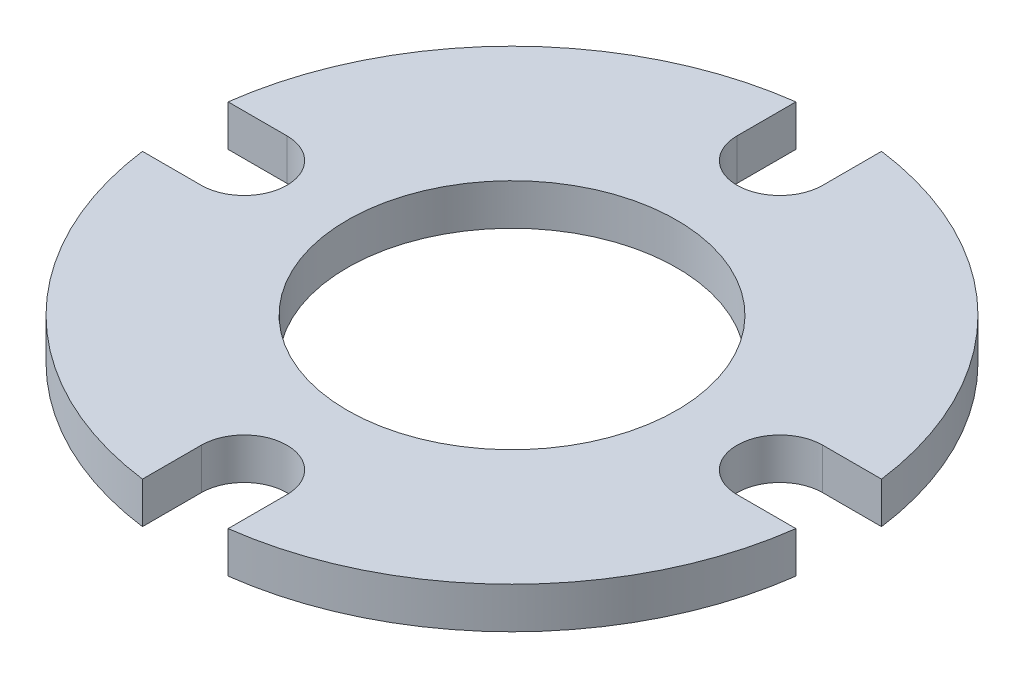
ISO-10303-21;
HEADER;
FILE_DESCRIPTION(('STEP AP214'),'2;1');
FILE_NAME('part.step','',(''),(''),'','','');
FILE_SCHEMA(('AUTOMOTIVE_DESIGN { 1 0 10303 214 1 1 1 1 }'));
ENDSEC;
DATA;
#1=APPLICATION_CONTEXT('core data for automotive mechanical design processes');
#2=APPLICATION_PROTOCOL_DEFINITION('international standard','automotive_design',2000,#1);
#3=PRODUCT_CONTEXT('',#1,'mechanical');
#4=PRODUCT('Part','Part','',(#3));
#5=PRODUCT_RELATED_PRODUCT_CATEGORY('part','',(#4));
#6=PRODUCT_DEFINITION_FORMATION('','',#4);
#7=PRODUCT_DEFINITION_CONTEXT('part definition',#1,'design');
#8=PRODUCT_DEFINITION('design','',#6,#7);
#9=PRODUCT_DEFINITION_SHAPE('','',#8);
#10=(LENGTH_UNIT() NAMED_UNIT(*) SI_UNIT(.MILLI.,.METRE.));
#11=(NAMED_UNIT(*) PLANE_ANGLE_UNIT() SI_UNIT($,.RADIAN.));
#12=(NAMED_UNIT(*) SI_UNIT($,.STERADIAN.) SOLID_ANGLE_UNIT());
#13=UNCERTAINTY_MEASURE_WITH_UNIT(LENGTH_MEASURE(1.E-05),#10,'distance_accuracy_value','');
#14=(GEOMETRIC_REPRESENTATION_CONTEXT(3) GLOBAL_UNCERTAINTY_ASSIGNED_CONTEXT((#13)) GLOBAL_UNIT_ASSIGNED_CONTEXT((#10,
#11,#12)) REPRESENTATION_CONTEXT('',''));
#15=CARTESIAN_POINT('',(0.,0.,0.));
#16=DIRECTION('',(0.,0.,1.));
#17=DIRECTION('',(1.,0.,0.));
#18=AXIS2_PLACEMENT_3D('',#15,#16,#17);
#19=CARTESIAN_POINT('',(0.,0.125,0.));
#20=DIRECTION('',(0.,1.,0.));
#21=DIRECTION('',(0.,0.,1.));
#22=AXIS2_PLACEMENT_3D('',#19,#20,#21);
#23=PLANE('',#22);
#24=CARTESIAN_POINT('',(0.,0.125,0.));
#25=DIRECTION('',(0.,1.,0.));
#26=DIRECTION('',(0.,0.,1.));
#27=AXIS2_PLACEMENT_3D('',#24,#25,#26);
#28=CIRCLE('',#27,0.999999999999999);
#29=CARTESIAN_POINT('',(-0.13,0.125,-0.991513993849809));
#30=VERTEX_POINT('',#29);
#31=CARTESIAN_POINT('',(-0.991513993849809,0.125,-0.13));
#32=VERTEX_POINT('',#31);
#33=EDGE_CURVE('E213',#30,#32,#28,.T.);
#34=ORIENTED_EDGE('',*,*,#33,.T.);
#35=DIRECTION('',(1.,0.,0.));
#36=VECTOR('',#35,1.);
#37=CARTESIAN_POINT('',(-0.991513993849809,0.125,-0.13));
#38=LINE('',#37,#36);
#39=CARTESIAN_POINT('',(-0.813,0.125,-0.13));
#40=VERTEX_POINT('',#39);
#41=EDGE_CURVE('E121',#32,#40,#38,.T.);
#42=ORIENTED_EDGE('',*,*,#41,.T.);
#43=CARTESIAN_POINT('',(-0.813,0.125,0.));
#44=DIRECTION('',(0.,-1.,0.));
#45=DIRECTION('',(0.,0.,1.));
#46=AXIS2_PLACEMENT_3D('',#43,#44,#45);
#47=CIRCLE('',#46,0.13);
#48=CARTESIAN_POINT('',(-0.813,0.125,0.13));
#49=VERTEX_POINT('',#48);
#50=EDGE_CURVE('E252',#40,#49,#47,.T.);
#51=ORIENTED_EDGE('',*,*,#50,.T.);
#52=DIRECTION('',(-1.,0.,0.));
#53=VECTOR('',#52,1.);
#54=CARTESIAN_POINT('',(-0.991513993849809,0.125,0.13));
#55=LINE('',#54,#53);
#56=CARTESIAN_POINT('',(-0.991513993849809,0.125,0.13));
#57=VERTEX_POINT('',#56);
#58=EDGE_CURVE('E271',#49,#57,#55,.T.);
#59=ORIENTED_EDGE('',*,*,#58,.T.);
#60=CARTESIAN_POINT('',(0.,0.125,0.));
#61=DIRECTION('',(0.,1.,0.));
#62=DIRECTION('',(0.,0.,1.));
#63=AXIS2_PLACEMENT_3D('',#60,#61,#62);
#64=CIRCLE('',#63,0.999999999999999);
#65=CARTESIAN_POINT('',(-0.13,0.125,0.991513993849809));
#66=VERTEX_POINT('',#65);
#67=EDGE_CURVE('E268',#57,#66,#64,.T.);
#68=ORIENTED_EDGE('',*,*,#67,.T.);
#69=DIRECTION('',(0.,0.,-1.));
#70=VECTOR('',#69,1.);
#71=CARTESIAN_POINT('',(-0.13,0.125,0.991513993849809));
#72=LINE('',#71,#70);
#73=CARTESIAN_POINT('',(-0.13,0.125,0.813));
#74=VERTEX_POINT('',#73);
#75=EDGE_CURVE('E270',#66,#74,#72,.T.);
#76=ORIENTED_EDGE('',*,*,#75,.T.);
#77=CARTESIAN_POINT('',(0.,0.125,0.813));
#78=DIRECTION('',(0.,-1.,0.));
#79=DIRECTION('',(0.,0.,-1.));
#80=AXIS2_PLACEMENT_3D('',#77,#78,#79);
#81=CIRCLE('',#80,0.13);
#82=CARTESIAN_POINT('',(0.13,0.125,0.813));
#83=VERTEX_POINT('',#82);
#84=EDGE_CURVE('E273',#74,#83,#81,.T.);
#85=ORIENTED_EDGE('',*,*,#84,.T.);
#86=DIRECTION('',(0.,0.,1.));
#87=VECTOR('',#86,1.);
#88=CARTESIAN_POINT('',(0.13,0.125,0.991513993849809));
#89=LINE('',#88,#87);
#90=CARTESIAN_POINT('',(0.13,0.125,0.991513993849809));
#91=VERTEX_POINT('',#90);
#92=EDGE_CURVE('E279',#83,#91,#89,.T.);
#93=ORIENTED_EDGE('',*,*,#92,.T.);
#94=CARTESIAN_POINT('',(0.,0.125,0.));
#95=DIRECTION('',(0.,1.,0.));
#96=DIRECTION('',(0.,0.,1.));
#97=AXIS2_PLACEMENT_3D('',#94,#95,#96);
#98=CIRCLE('',#97,0.999999999999999);
#99=CARTESIAN_POINT('',(0.991513993849809,0.125,0.129999999999999));
#100=VERTEX_POINT('',#99);
#101=EDGE_CURVE('E281',#91,#100,#98,.T.);
#102=ORIENTED_EDGE('',*,*,#101,.T.);
#103=DIRECTION('',(-1.,0.,0.));
#104=VECTOR('',#103,1.);
#105=CARTESIAN_POINT('',(0.991513993849809,0.125,0.129999999999999));
#106=LINE('',#105,#104);
#107=CARTESIAN_POINT('',(0.813,0.125,0.129999999999999));
#108=VERTEX_POINT('',#107);
#109=EDGE_CURVE('E283',#100,#108,#106,.T.);
#110=ORIENTED_EDGE('',*,*,#109,.T.);
#111=CARTESIAN_POINT('',(0.813,0.125,0.));
#112=DIRECTION('',(0.,-1.,0.));
#113=DIRECTION('',(0.,0.,-1.));
#114=AXIS2_PLACEMENT_3D('',#111,#112,#113);
#115=CIRCLE('',#114,0.13);
#116=CARTESIAN_POINT('',(0.813,0.125,-0.130000000000001));
#117=VERTEX_POINT('',#116);
#118=EDGE_CURVE('E285',#108,#117,#115,.T.);
#119=ORIENTED_EDGE('',*,*,#118,.T.);
#120=DIRECTION('',(1.,0.,0.));
#121=VECTOR('',#120,1.);
#122=CARTESIAN_POINT('',(0.991513993849809,0.125,-0.130000000000001));
#123=LINE('',#122,#121);
#124=CARTESIAN_POINT('',(0.991513993849809,0.125,-0.130000000000001));
#125=VERTEX_POINT('',#124);
#126=EDGE_CURVE('E287',#117,#125,#123,.T.);
#127=ORIENTED_EDGE('',*,*,#126,.T.);
#128=CARTESIAN_POINT('',(0.,0.125,0.));
#129=DIRECTION('',(0.,1.,0.));
#130=DIRECTION('',(0.,0.,1.));
#131=AXIS2_PLACEMENT_3D('',#128,#129,#130);
#132=CIRCLE('',#131,1.);
#133=CARTESIAN_POINT('',(0.13,0.125,-0.991513993849809));
#134=VERTEX_POINT('',#133);
#135=EDGE_CURVE('E164',#125,#134,#132,.T.);
#136=ORIENTED_EDGE('',*,*,#135,.T.);
#137=DIRECTION('',(0.,0.,1.));
#138=VECTOR('',#137,1.);
#139=CARTESIAN_POINT('',(0.13,0.125,-0.991513993849809));
#140=LINE('',#139,#138);
#141=CARTESIAN_POINT('',(0.13,0.125,-0.813));
#142=VERTEX_POINT('',#141);
#143=EDGE_CURVE('E158',#134,#142,#140,.T.);
#144=ORIENTED_EDGE('',*,*,#143,.T.);
#145=CARTESIAN_POINT('',(0.,0.125,-0.813));
#146=DIRECTION('',(0.,-1.,0.));
#147=DIRECTION('',(0.,0.,1.));
#148=AXIS2_PLACEMENT_3D('',#145,#146,#147);
#149=CIRCLE('',#148,0.13);
#150=CARTESIAN_POINT('',(-0.13,0.125,-0.813));
#151=VERTEX_POINT('',#150);
#152=EDGE_CURVE('E162',#142,#151,#149,.T.);
#153=ORIENTED_EDGE('',*,*,#152,.T.);
#154=DIRECTION('',(0.,0.,-1.));
#155=VECTOR('',#154,1.);
#156=CARTESIAN_POINT('',(-0.13,0.125,-0.991513993849809));
#157=LINE('',#156,#155);
#158=EDGE_CURVE('E54',#151,#30,#157,.T.);
#159=ORIENTED_EDGE('',*,*,#158,.T.);
#160=EDGE_LOOP('',(#34,#42,#51,#59,#68,#76,#85,#93,#102,#110,#119,#127,#136,#144,#153,#159));
#161=FACE_BOUND('',#160,.T.);
#162=CARTESIAN_POINT('',(0.,0.125,0.));
#163=DIRECTION('',(0.,1.,0.));
#164=DIRECTION('',(0.,0.,1.));
#165=AXIS2_PLACEMENT_3D('',#162,#163,#164);
#166=CIRCLE('',#165,0.5);
#167=CARTESIAN_POINT('',(0.,0.125,0.5));
#168=VERTEX_POINT('',#167);
#169=EDGE_CURVE('E186',#168,#168,#166,.T.);
#170=ORIENTED_EDGE('',*,*,#169,.F.);
#171=EDGE_LOOP('',(#170));
#172=FACE_BOUND('',#171,.T.);
#173=ADVANCED_FACE('F37',(#161,#172),#23,.T.);
#174=CARTESIAN_POINT('',(0.,0.,0.));
#175=DIRECTION('',(0.,1.,0.));
#176=DIRECTION('',(0.,0.,1.));
#177=AXIS2_PLACEMENT_3D('',#174,#175,#176);
#178=PLANE('',#177);
#179=CARTESIAN_POINT('',(0.,0.,0.));
#180=DIRECTION('',(0.,1.,0.));
#181=DIRECTION('',(0.,0.,1.));
#182=AXIS2_PLACEMENT_3D('',#179,#180,#181);
#183=CIRCLE('',#182,0.999999999999999);
#184=CARTESIAN_POINT('',(-0.13,0.,-0.991513993849809));
#185=VERTEX_POINT('',#184);
#186=CARTESIAN_POINT('',(-0.991513993849809,0.,-0.13));
#187=VERTEX_POINT('',#186);
#188=EDGE_CURVE('E182',#185,#187,#183,.T.);
#189=ORIENTED_EDGE('',*,*,#188,.F.);
#190=DIRECTION('',(0.,0.,-1.));
#191=VECTOR('',#190,1.);
#192=CARTESIAN_POINT('',(-0.13,0.,-0.991513993849809));
#193=LINE('',#192,#191);
#194=CARTESIAN_POINT('',(-0.13,0.,-0.813));
#195=VERTEX_POINT('',#194);
#196=EDGE_CURVE('E113',#195,#185,#193,.T.);
#197=ORIENTED_EDGE('',*,*,#196,.F.);
#198=CARTESIAN_POINT('',(0.,0.,-0.813));
#199=DIRECTION('',(0.,-1.,0.));
#200=DIRECTION('',(0.,0.,1.));
#201=AXIS2_PLACEMENT_3D('',#198,#199,#200);
#202=CIRCLE('',#201,0.13);
#203=CARTESIAN_POINT('',(0.13,0.,-0.813));
#204=VERTEX_POINT('',#203);
#205=EDGE_CURVE('E107',#204,#195,#202,.T.);
#206=ORIENTED_EDGE('',*,*,#205,.F.);
#207=DIRECTION('',(0.,0.,1.));
#208=VECTOR('',#207,1.);
#209=CARTESIAN_POINT('',(0.13,0.,-0.991513993849809));
#210=LINE('',#209,#208);
#211=CARTESIAN_POINT('',(0.13,0.,-0.991513993849809));
#212=VERTEX_POINT('',#211);
#213=EDGE_CURVE('E172',#212,#204,#210,.T.);
#214=ORIENTED_EDGE('',*,*,#213,.F.);
#215=CARTESIAN_POINT('',(0.,0.,0.));
#216=DIRECTION('',(0.,1.,0.));
#217=DIRECTION('',(0.,0.,1.));
#218=AXIS2_PLACEMENT_3D('',#215,#216,#217);
#219=CIRCLE('',#218,1.);
#220=CARTESIAN_POINT('',(0.991513993849809,0.,-0.130000000000001));
#221=VERTEX_POINT('',#220);
#222=EDGE_CURVE('E208',#221,#212,#219,.T.);
#223=ORIENTED_EDGE('',*,*,#222,.F.);
#224=DIRECTION('',(1.,0.,0.));
#225=VECTOR('',#224,1.);
#226=CARTESIAN_POINT('',(0.991513993849809,0.,-0.130000000000001));
#227=LINE('',#226,#225);
#228=CARTESIAN_POINT('',(0.813,0.,-0.130000000000001));
#229=VERTEX_POINT('',#228);
#230=EDGE_CURVE('E206',#229,#221,#227,.T.);
#231=ORIENTED_EDGE('',*,*,#230,.F.);
#232=CARTESIAN_POINT('',(0.813,0.,0.));
#233=DIRECTION('',(0.,-1.,0.));
#234=DIRECTION('',(0.,0.,-1.));
#235=AXIS2_PLACEMENT_3D('',#232,#233,#234);
#236=CIRCLE('',#235,0.13);
#237=CARTESIAN_POINT('',(0.813,0.,0.129999999999999));
#238=VERTEX_POINT('',#237);
#239=EDGE_CURVE('E204',#238,#229,#236,.T.);
#240=ORIENTED_EDGE('',*,*,#239,.F.);
#241=DIRECTION('',(-1.,0.,0.));
#242=VECTOR('',#241,1.);
#243=CARTESIAN_POINT('',(0.991513993849809,0.,0.129999999999999));
#244=LINE('',#243,#242);
#245=CARTESIAN_POINT('',(0.991513993849809,0.,0.129999999999999));
#246=VERTEX_POINT('',#245);
#247=EDGE_CURVE('E202',#246,#238,#244,.T.);
#248=ORIENTED_EDGE('',*,*,#247,.F.);
#249=CARTESIAN_POINT('',(0.,0.,0.));
#250=DIRECTION('',(0.,1.,0.));
#251=DIRECTION('',(0.,0.,1.));
#252=AXIS2_PLACEMENT_3D('',#249,#250,#251);
#253=CIRCLE('',#252,0.999999999999999);
#254=CARTESIAN_POINT('',(0.13,0.,0.991513993849809));
#255=VERTEX_POINT('',#254);
#256=EDGE_CURVE('E200',#255,#246,#253,.T.);
#257=ORIENTED_EDGE('',*,*,#256,.F.);
#258=DIRECTION('',(0.,0.,1.));
#259=VECTOR('',#258,1.);
#260=CARTESIAN_POINT('',(0.13,0.,0.991513993849809));
#261=LINE('',#260,#259);
#262=CARTESIAN_POINT('',(0.13,0.,0.813));
#263=VERTEX_POINT('',#262);
#264=EDGE_CURVE('E198',#263,#255,#261,.T.);
#265=ORIENTED_EDGE('',*,*,#264,.F.);
#266=CARTESIAN_POINT('',(0.,0.,0.813));
#267=DIRECTION('',(0.,-1.,0.));
#268=DIRECTION('',(0.,0.,-1.));
#269=AXIS2_PLACEMENT_3D('',#266,#267,#268);
#270=CIRCLE('',#269,0.13);
#271=CARTESIAN_POINT('',(-0.13,0.,0.813));
#272=VERTEX_POINT('',#271);
#273=EDGE_CURVE('E196',#272,#263,#270,.T.);
#274=ORIENTED_EDGE('',*,*,#273,.F.);
#275=DIRECTION('',(0.,0.,-1.));
#276=VECTOR('',#275,1.);
#277=CARTESIAN_POINT('',(-0.13,0.,0.991513993849809));
#278=LINE('',#277,#276);
#279=CARTESIAN_POINT('',(-0.13,0.,0.991513993849809));
#280=VERTEX_POINT('',#279);
#281=EDGE_CURVE('E194',#280,#272,#278,.T.);
#282=ORIENTED_EDGE('',*,*,#281,.F.);
#283=CARTESIAN_POINT('',(0.,0.,0.));
#284=DIRECTION('',(0.,1.,0.));
#285=DIRECTION('',(0.,0.,1.));
#286=AXIS2_PLACEMENT_3D('',#283,#284,#285);
#287=CIRCLE('',#286,0.999999999999999);
#288=CARTESIAN_POINT('',(-0.991513993849809,0.,0.13));
#289=VERTEX_POINT('',#288);
#290=EDGE_CURVE('E192',#289,#280,#287,.T.);
#291=ORIENTED_EDGE('',*,*,#290,.F.);
#292=DIRECTION('',(-1.,0.,0.));
#293=VECTOR('',#292,1.);
#294=CARTESIAN_POINT('',(-0.991513993849809,0.,0.13));
#295=LINE('',#294,#293);
#296=CARTESIAN_POINT('',(-0.813,0.,0.13));
#297=VERTEX_POINT('',#296);
#298=EDGE_CURVE('E190',#297,#289,#295,.T.);
#299=ORIENTED_EDGE('',*,*,#298,.F.);
#300=CARTESIAN_POINT('',(-0.813,0.,0.));
#301=DIRECTION('',(0.,-1.,0.));
#302=DIRECTION('',(0.,0.,1.));
#303=AXIS2_PLACEMENT_3D('',#300,#301,#302);
#304=CIRCLE('',#303,0.13);
#305=CARTESIAN_POINT('',(-0.813,0.,-0.13));
#306=VERTEX_POINT('',#305);
#307=EDGE_CURVE('E188',#306,#297,#304,.T.);
#308=ORIENTED_EDGE('',*,*,#307,.F.);
#309=DIRECTION('',(1.,0.,0.));
#310=VECTOR('',#309,1.);
#311=CARTESIAN_POINT('',(-0.991513993849809,0.,-0.13));
#312=LINE('',#311,#310);
#313=EDGE_CURVE('E185',#187,#306,#312,.T.);
#314=ORIENTED_EDGE('',*,*,#313,.F.);
#315=EDGE_LOOP('',(#189,#197,#206,#214,#223,#231,#240,#248,#257,#265,#274,#282,#291,#299,#308,#314));
#316=FACE_BOUND('',#315,.T.);
#317=CARTESIAN_POINT('',(0.,0.,0.));
#318=DIRECTION('',(0.,1.,0.));
#319=DIRECTION('',(0.,0.,1.));
#320=AXIS2_PLACEMENT_3D('',#317,#318,#319);
#321=CIRCLE('',#320,0.5);
#322=CARTESIAN_POINT('',(0.,0.,0.5));
#323=VERTEX_POINT('',#322);
#324=EDGE_CURVE('E524',#323,#323,#321,.T.);
#325=ORIENTED_EDGE('',*,*,#324,.T.);
#326=EDGE_LOOP('',(#325));
#327=FACE_BOUND('',#326,.T.);
#328=ADVANCED_FACE('F256',(#316,#327),#178,.F.);
#329=CARTESIAN_POINT('',(0.,0.125,0.));
#330=DIRECTION('',(0.,-1.,0.));
#331=DIRECTION('',(0.,0.,-1.));
#332=AXIS2_PLACEMENT_3D('',#329,#330,#331);
#333=CYLINDRICAL_SURFACE('',#332,0.999999999999999);
#334=ORIENTED_EDGE('',*,*,#188,.T.);
#335=DIRECTION('',(0.,-1.,0.));
#336=VECTOR('',#335,1.);
#337=CARTESIAN_POINT('',(-0.991513993849809,0.125,-0.13));
#338=LINE('',#337,#336);
#339=EDGE_CURVE('E11',#32,#187,#338,.T.);
#340=ORIENTED_EDGE('',*,*,#339,.F.);
#341=ORIENTED_EDGE('',*,*,#33,.F.);
#342=DIRECTION('',(0.,-1.,0.));
#343=VECTOR('',#342,1.);
#344=CARTESIAN_POINT('',(-0.13,0.125,-0.991513993849809));
#345=LINE('',#344,#343);
#346=EDGE_CURVE('E178',#30,#185,#345,.T.);
#347=ORIENTED_EDGE('',*,*,#346,.T.);
#348=EDGE_LOOP('',(#334,#340,#341,#347));
#349=FACE_BOUND('',#348,.T.);
#350=ADVANCED_FACE('F39',(#349),#333,.T.);
#351=CARTESIAN_POINT('',(-0.991513993849809,0.125,-0.13));
#352=DIRECTION('',(0.,0.,-1.));
#353=DIRECTION('',(-1.,0.,0.));
#354=AXIS2_PLACEMENT_3D('',#351,#352,#353);
#355=PLANE('',#354);
#356=ORIENTED_EDGE('',*,*,#313,.T.);
#357=DIRECTION('',(0.,-1.,0.));
#358=VECTOR('',#357,1.);
#359=CARTESIAN_POINT('',(-0.813,0.125,-0.13));
#360=LINE('',#359,#358);
#361=EDGE_CURVE('E46',#40,#306,#360,.T.);
#362=ORIENTED_EDGE('',*,*,#361,.F.);
#363=ORIENTED_EDGE('',*,*,#41,.F.);
#364=ORIENTED_EDGE('',*,*,#339,.T.);
#365=EDGE_LOOP('',(#356,#362,#363,#364));
#366=FACE_BOUND('',#365,.T.);
#367=ADVANCED_FACE('F321',(#366),#355,.F.);
#368=CARTESIAN_POINT('',(-0.813,0.125,0.));
#369=DIRECTION('',(0.,-1.,0.));
#370=DIRECTION('',(0.,0.,-1.));
#371=AXIS2_PLACEMENT_3D('',#368,#369,#370);
#372=CYLINDRICAL_SURFACE('',#371,0.13);
#373=ORIENTED_EDGE('',*,*,#307,.T.);
#374=DIRECTION('',(0.,-1.,0.));
#375=VECTOR('',#374,1.);
#376=CARTESIAN_POINT('',(-0.813,0.125,0.13));
#377=LINE('',#376,#375);
#378=EDGE_CURVE('E244',#49,#297,#377,.T.);
#379=ORIENTED_EDGE('',*,*,#378,.F.);
#380=ORIENTED_EDGE('',*,*,#50,.F.);
#381=ORIENTED_EDGE('',*,*,#361,.T.);
#382=EDGE_LOOP('',(#373,#379,#380,#381));
#383=FACE_BOUND('',#382,.T.);
#384=ADVANCED_FACE('F250',(#383),#372,.F.);
#385=CARTESIAN_POINT('',(-0.991513993849809,0.125,0.13));
#386=DIRECTION('',(0.,0.,1.));
#387=DIRECTION('',(1.,0.,0.));
#388=AXIS2_PLACEMENT_3D('',#385,#386,#387);
#389=PLANE('',#388);
#390=ORIENTED_EDGE('',*,*,#298,.T.);
#391=DIRECTION('',(0.,-1.,0.));
#392=VECTOR('',#391,1.);
#393=CARTESIAN_POINT('',(-0.991513993849809,0.125,0.13));
#394=LINE('',#393,#392);
#395=EDGE_CURVE('E241',#57,#289,#394,.T.);
#396=ORIENTED_EDGE('',*,*,#395,.F.);
#397=ORIENTED_EDGE('',*,*,#58,.F.);
#398=ORIENTED_EDGE('',*,*,#378,.T.);
#399=EDGE_LOOP('',(#390,#396,#397,#398));
#400=FACE_BOUND('',#399,.T.);
#401=ADVANCED_FACE('F262',(#400),#389,.F.);
#402=CARTESIAN_POINT('',(0.,0.125,0.));
#403=DIRECTION('',(0.,-1.,0.));
#404=DIRECTION('',(0.,0.,-1.));
#405=AXIS2_PLACEMENT_3D('',#402,#403,#404);
#406=CYLINDRICAL_SURFACE('',#405,0.999999999999999);
#407=ORIENTED_EDGE('',*,*,#290,.T.);
#408=DIRECTION('',(0.,-1.,0.));
#409=VECTOR('',#408,1.);
#410=CARTESIAN_POINT('',(-0.13,0.125,0.991513993849809));
#411=LINE('',#410,#409);
#412=EDGE_CURVE('E238',#66,#280,#411,.T.);
#413=ORIENTED_EDGE('',*,*,#412,.F.);
#414=ORIENTED_EDGE('',*,*,#67,.F.);
#415=ORIENTED_EDGE('',*,*,#395,.T.);
#416=EDGE_LOOP('',(#407,#413,#414,#415));
#417=FACE_BOUND('',#416,.T.);
#418=ADVANCED_FACE('F266',(#417),#406,.T.);
#419=CARTESIAN_POINT('',(-0.13,0.125,0.991513993849809));
#420=DIRECTION('',(-1.,0.,0.));
#421=DIRECTION('',(0.,0.,1.));
#422=AXIS2_PLACEMENT_3D('',#419,#420,#421);
#423=PLANE('',#422);
#424=ORIENTED_EDGE('',*,*,#281,.T.);
#425=DIRECTION('',(0.,-1.,0.));
#426=VECTOR('',#425,1.);
#427=CARTESIAN_POINT('',(-0.13,0.125,0.813));
#428=LINE('',#427,#426);
#429=EDGE_CURVE('E235',#74,#272,#428,.T.);
#430=ORIENTED_EDGE('',*,*,#429,.F.);
#431=ORIENTED_EDGE('',*,*,#75,.F.);
#432=ORIENTED_EDGE('',*,*,#412,.T.);
#433=EDGE_LOOP('',(#424,#430,#431,#432));
#434=FACE_BOUND('',#433,.T.);
#435=ADVANCED_FACE('F334',(#434),#423,.F.);
#436=CARTESIAN_POINT('',(0.,0.125,0.813));
#437=DIRECTION('',(0.,-1.,0.));
#438=DIRECTION('',(0.,0.,-1.));
#439=AXIS2_PLACEMENT_3D('',#436,#437,#438);
#440=CYLINDRICAL_SURFACE('',#439,0.13);
#441=ORIENTED_EDGE('',*,*,#273,.T.);
#442=DIRECTION('',(0.,-1.,0.));
#443=VECTOR('',#442,1.);
#444=CARTESIAN_POINT('',(0.13,0.125,0.813));
#445=LINE('',#444,#443);
#446=EDGE_CURVE('E232',#83,#263,#445,.T.);
#447=ORIENTED_EDGE('',*,*,#446,.F.);
#448=ORIENTED_EDGE('',*,*,#84,.F.);
#449=ORIENTED_EDGE('',*,*,#429,.T.);
#450=EDGE_LOOP('',(#441,#447,#448,#449));
#451=FACE_BOUND('',#450,.T.);
#452=ADVANCED_FACE('F337',(#451),#440,.F.);
#453=CARTESIAN_POINT('',(0.13,0.125,0.991513993849809));
#454=DIRECTION('',(1.,0.,0.));
#455=DIRECTION('',(0.,0.,-1.));
#456=AXIS2_PLACEMENT_3D('',#453,#454,#455);
#457=PLANE('',#456);
#458=ORIENTED_EDGE('',*,*,#264,.T.);
#459=DIRECTION('',(0.,-1.,0.));
#460=VECTOR('',#459,1.);
#461=CARTESIAN_POINT('',(0.13,0.125,0.991513993849809));
#462=LINE('',#461,#460);
#463=EDGE_CURVE('E229',#91,#255,#462,.T.);
#464=ORIENTED_EDGE('',*,*,#463,.F.);
#465=ORIENTED_EDGE('',*,*,#92,.F.);
#466=ORIENTED_EDGE('',*,*,#446,.T.);
#467=EDGE_LOOP('',(#458,#464,#465,#466));
#468=FACE_BOUND('',#467,.T.);
#469=ADVANCED_FACE('F341',(#468),#457,.F.);
#470=CARTESIAN_POINT('',(0.,0.125,0.));
#471=DIRECTION('',(0.,-1.,0.));
#472=DIRECTION('',(0.,0.,-1.));
#473=AXIS2_PLACEMENT_3D('',#470,#471,#472);
#474=CYLINDRICAL_SURFACE('',#473,0.999999999999999);
#475=ORIENTED_EDGE('',*,*,#256,.T.);
#476=DIRECTION('',(0.,-1.,0.));
#477=VECTOR('',#476,1.);
#478=CARTESIAN_POINT('',(0.991513993849809,0.125,0.129999999999999));
#479=LINE('',#478,#477);
#480=EDGE_CURVE('E226',#100,#246,#479,.T.);
#481=ORIENTED_EDGE('',*,*,#480,.F.);
#482=ORIENTED_EDGE('',*,*,#101,.F.);
#483=ORIENTED_EDGE('',*,*,#463,.T.);
#484=EDGE_LOOP('',(#475,#481,#482,#483));
#485=FACE_BOUND('',#484,.T.);
#486=ADVANCED_FACE('F345',(#485),#474,.T.);
#487=CARTESIAN_POINT('',(0.991513993849809,0.125,0.129999999999999));
#488=DIRECTION('',(0.,0.,1.));
#489=DIRECTION('',(1.,0.,0.));
#490=AXIS2_PLACEMENT_3D('',#487,#488,#489);
#491=PLANE('',#490);
#492=ORIENTED_EDGE('',*,*,#247,.T.);
#493=DIRECTION('',(0.,-1.,0.));
#494=VECTOR('',#493,1.);
#495=CARTESIAN_POINT('',(0.813,0.125,0.129999999999999));
#496=LINE('',#495,#494);
#497=EDGE_CURVE('E223',#108,#238,#496,.T.);
#498=ORIENTED_EDGE('',*,*,#497,.F.);
#499=ORIENTED_EDGE('',*,*,#109,.F.);
#500=ORIENTED_EDGE('',*,*,#480,.T.);
#501=EDGE_LOOP('',(#492,#498,#499,#500));
#502=FACE_BOUND('',#501,.T.);
#503=ADVANCED_FACE('F349',(#502),#491,.F.);
#504=CARTESIAN_POINT('',(0.813,0.125,0.));
#505=DIRECTION('',(0.,-1.,0.));
#506=DIRECTION('',(0.,0.,-1.));
#507=AXIS2_PLACEMENT_3D('',#504,#505,#506);
#508=CYLINDRICAL_SURFACE('',#507,0.13);
#509=ORIENTED_EDGE('',*,*,#239,.T.);
#510=DIRECTION('',(0.,-1.,0.));
#511=VECTOR('',#510,1.);
#512=CARTESIAN_POINT('',(0.813,0.125,-0.130000000000001));
#513=LINE('',#512,#511);
#514=EDGE_CURVE('E220',#117,#229,#513,.T.);
#515=ORIENTED_EDGE('',*,*,#514,.F.);
#516=ORIENTED_EDGE('',*,*,#118,.F.);
#517=ORIENTED_EDGE('',*,*,#497,.T.);
#518=EDGE_LOOP('',(#509,#515,#516,#517));
#519=FACE_BOUND('',#518,.T.);
#520=ADVANCED_FACE('F353',(#519),#508,.F.);
#521=CARTESIAN_POINT('',(0.991513993849809,0.125,-0.130000000000001));
#522=DIRECTION('',(0.,0.,-1.));
#523=DIRECTION('',(-1.,0.,0.));
#524=AXIS2_PLACEMENT_3D('',#521,#522,#523);
#525=PLANE('',#524);
#526=ORIENTED_EDGE('',*,*,#230,.T.);
#527=DIRECTION('',(0.,-1.,0.));
#528=VECTOR('',#527,1.);
#529=CARTESIAN_POINT('',(0.991513993849809,0.125,-0.130000000000001));
#530=LINE('',#529,#528);
#531=EDGE_CURVE('E217',#125,#221,#530,.T.);
#532=ORIENTED_EDGE('',*,*,#531,.F.);
#533=ORIENTED_EDGE('',*,*,#126,.F.);
#534=ORIENTED_EDGE('',*,*,#514,.T.);
#535=EDGE_LOOP('',(#526,#532,#533,#534));
#536=FACE_BOUND('',#535,.T.);
#537=ADVANCED_FACE('F293',(#536),#525,.F.);
#538=CARTESIAN_POINT('',(0.,0.125,0.));
#539=DIRECTION('',(0.,-1.,0.));
#540=DIRECTION('',(0.,0.,-1.));
#541=AXIS2_PLACEMENT_3D('',#538,#539,#540);
#542=CYLINDRICAL_SURFACE('',#541,1.);
#543=ORIENTED_EDGE('',*,*,#222,.T.);
#544=DIRECTION('',(0.,-1.,0.));
#545=VECTOR('',#544,1.);
#546=CARTESIAN_POINT('',(0.13,0.125,-0.991513993849809));
#547=LINE('',#546,#545);
#548=EDGE_CURVE('E173',#134,#212,#547,.T.);
#549=ORIENTED_EDGE('',*,*,#548,.F.);
#550=ORIENTED_EDGE('',*,*,#135,.F.);
#551=ORIENTED_EDGE('',*,*,#531,.T.);
#552=EDGE_LOOP('',(#543,#549,#550,#551));
#553=FACE_BOUND('',#552,.T.);
#554=ADVANCED_FACE('F297',(#553),#542,.T.);
#555=CARTESIAN_POINT('',(0.13,0.125,-0.991513993849809));
#556=DIRECTION('',(1.,0.,0.));
#557=DIRECTION('',(0.,0.,-1.));
#558=AXIS2_PLACEMENT_3D('',#555,#556,#557);
#559=PLANE('',#558);
#560=ORIENTED_EDGE('',*,*,#213,.T.);
#561=DIRECTION('',(0.,-1.,0.));
#562=VECTOR('',#561,1.);
#563=CARTESIAN_POINT('',(0.13,0.125,-0.813));
#564=LINE('',#563,#562);
#565=EDGE_CURVE('E169',#142,#204,#564,.T.);
#566=ORIENTED_EDGE('',*,*,#565,.F.);
#567=ORIENTED_EDGE('',*,*,#143,.F.);
#568=ORIENTED_EDGE('',*,*,#548,.T.);
#569=EDGE_LOOP('',(#560,#566,#567,#568));
#570=FACE_BOUND('',#569,.T.);
#571=ADVANCED_FACE('F170',(#570),#559,.F.);
#572=CARTESIAN_POINT('',(0.,0.125,-0.813));
#573=DIRECTION('',(0.,-1.,0.));
#574=DIRECTION('',(0.,0.,-1.));
#575=AXIS2_PLACEMENT_3D('',#572,#573,#574);
#576=CYLINDRICAL_SURFACE('',#575,0.13);
#577=ORIENTED_EDGE('',*,*,#205,.T.);
#578=DIRECTION('',(0.,-1.,0.));
#579=VECTOR('',#578,1.);
#580=CARTESIAN_POINT('',(-0.13,0.125,-0.813));
#581=LINE('',#580,#579);
#582=EDGE_CURVE('E174',#151,#195,#581,.T.);
#583=ORIENTED_EDGE('',*,*,#582,.F.);
#584=ORIENTED_EDGE('',*,*,#152,.F.);
#585=ORIENTED_EDGE('',*,*,#565,.T.);
#586=EDGE_LOOP('',(#577,#583,#584,#585));
#587=FACE_BOUND('',#586,.T.);
#588=ADVANCED_FACE('F176',(#587),#576,.F.);
#589=CARTESIAN_POINT('',(-0.13,0.125,-0.991513993849809));
#590=DIRECTION('',(-1.,0.,0.));
#591=DIRECTION('',(0.,0.,1.));
#592=AXIS2_PLACEMENT_3D('',#589,#590,#591);
#593=PLANE('',#592);
#594=ORIENTED_EDGE('',*,*,#196,.T.);
#595=ORIENTED_EDGE('',*,*,#346,.F.);
#596=ORIENTED_EDGE('',*,*,#158,.F.);
#597=ORIENTED_EDGE('',*,*,#582,.T.);
#598=EDGE_LOOP('',(#594,#595,#596,#597));
#599=FACE_BOUND('',#598,.T.);
#600=ADVANCED_FACE('F301',(#599),#593,.F.);
#601=CARTESIAN_POINT('',(0.,0.125,0.));
#602=DIRECTION('',(0.,-1.,0.));
#603=DIRECTION('',(0.,0.,-1.));
#604=AXIS2_PLACEMENT_3D('',#601,#602,#603);
#605=CYLINDRICAL_SURFACE('',#604,0.5);
#606=ORIENTED_EDGE('',*,*,#169,.T.);
#607=EDGE_LOOP('',(#606));
#608=FACE_BOUND('',#607,.T.);
#609=ORIENTED_EDGE('',*,*,#324,.F.);
#610=EDGE_LOOP('',(#609));
#611=FACE_BOUND('',#610,.T.);
#612=ADVANCED_FACE('F303',(#608,#611),#605,.F.);
#613=CLOSED_SHELL('',(#173,#328,#350,#367,#384,#401,#418,#435,#452,#469,#486,#503,#520,#537,
#554,#571,#588,#600,#612));
#614=MANIFOLD_SOLID_BREP('B2',#613);
#615=ADVANCED_BREP_SHAPE_REPRESENTATION('',(#18,#614),#14);
#616=SHAPE_DEFINITION_REPRESENTATION(#9,#615);
ENDSEC;
END-ISO-10303-21;
